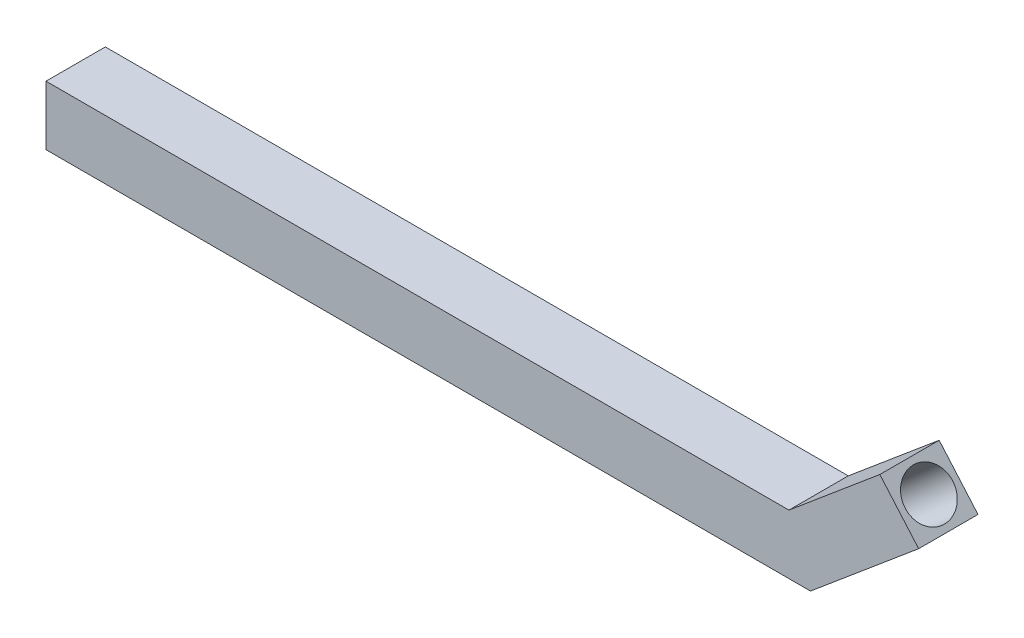
ISO-10303-21;
HEADER;
FILE_DESCRIPTION(('STEP AP214'),'2;1');
FILE_NAME('part.step','',(''),(''),'','','');
FILE_SCHEMA(('AUTOMOTIVE_DESIGN { 1 0 10303 214 1 1 1 1 }'));
ENDSEC;
DATA;
#1=APPLICATION_CONTEXT('core data for automotive mechanical design processes');
#2=APPLICATION_PROTOCOL_DEFINITION('international standard','automotive_design',2000,#1);
#3=PRODUCT_CONTEXT('',#1,'mechanical');
#4=PRODUCT('Part','Part','',(#3));
#5=PRODUCT_RELATED_PRODUCT_CATEGORY('part','',(#4));
#6=PRODUCT_DEFINITION_FORMATION('','',#4);
#7=PRODUCT_DEFINITION_CONTEXT('part definition',#1,'design');
#8=PRODUCT_DEFINITION('design','',#6,#7);
#9=PRODUCT_DEFINITION_SHAPE('','',#8);
#10=(LENGTH_UNIT() NAMED_UNIT(*) SI_UNIT(.MILLI.,.METRE.));
#11=(NAMED_UNIT(*) PLANE_ANGLE_UNIT() SI_UNIT($,.RADIAN.));
#12=(NAMED_UNIT(*) SI_UNIT($,.STERADIAN.) SOLID_ANGLE_UNIT());
#13=UNCERTAINTY_MEASURE_WITH_UNIT(LENGTH_MEASURE(1.E-05),#10,'distance_accuracy_value','');
#14=(GEOMETRIC_REPRESENTATION_CONTEXT(3) GLOBAL_UNCERTAINTY_ASSIGNED_CONTEXT((#13)) GLOBAL_UNIT_ASSIGNED_CONTEXT((#10,
#11,#12)) REPRESENTATION_CONTEXT('',''));
#15=CARTESIAN_POINT('',(0.,0.,0.));
#16=DIRECTION('',(0.,0.,1.));
#17=DIRECTION('',(1.,0.,0.));
#18=AXIS2_PLACEMENT_3D('',#15,#16,#17);
#19=CARTESIAN_POINT('',(-13.3,-2.5,2.5));
#20=DIRECTION('',(0.,1.,0.));
#21=DIRECTION('',(0.,0.,1.));
#22=AXIS2_PLACEMENT_3D('',#19,#20,#21);
#23=PLANE('',#22);
#24=DIRECTION('',(0.,0.,1.));
#25=VECTOR('',#24,1.);
#26=CARTESIAN_POINT('',(-31.3,-2.5,0.));
#27=LINE('',#26,#25);
#28=CARTESIAN_POINT('',(-31.3,-2.5,0.));
#29=VERTEX_POINT('',#28);
#30=CARTESIAN_POINT('',(-31.3,-2.5,2.5));
#31=VERTEX_POINT('',#30);
#32=EDGE_CURVE('E95',#29,#31,#27,.T.);
#33=ORIENTED_EDGE('',*,*,#32,.F.);
#34=DIRECTION('',(1.,0.,0.));
#35=VECTOR('',#34,1.);
#36=CARTESIAN_POINT('',(-13.3,-2.5,0.));
#37=LINE('',#36,#35);
#38=CARTESIAN_POINT('',(0.909480398793596,-2.5,0.));
#39=VERTEX_POINT('',#38);
#40=EDGE_CURVE('E103',#29,#39,#37,.T.);
#41=ORIENTED_EDGE('',*,*,#40,.T.);
#42=DIRECTION('',(0.,0.,-1.));
#43=VECTOR('',#42,1.);
#44=CARTESIAN_POINT('',(0.909480398793596,-2.5,2.5));
#45=LINE('',#44,#43);
#46=CARTESIAN_POINT('',(0.909480398793596,-2.5,2.5));
#47=VERTEX_POINT('',#46);
#48=EDGE_CURVE('E11',#47,#39,#45,.T.);
#49=ORIENTED_EDGE('',*,*,#48,.F.);
#50=DIRECTION('',(1.,0.,0.));
#51=VECTOR('',#50,1.);
#52=CARTESIAN_POINT('',(-13.3,-2.5,2.5));
#53=LINE('',#52,#51);
#54=EDGE_CURVE('E84',#31,#47,#53,.T.);
#55=ORIENTED_EDGE('',*,*,#54,.F.);
#56=EDGE_LOOP('',(#33,#41,#49,#55));
#57=FACE_BOUND('',#56,.T.);
#58=ADVANCED_FACE('F33',(#57),#23,.F.);
#59=CARTESIAN_POINT('',(-13.3,0.,2.5));
#60=DIRECTION('',(0.,-1.,0.));
#61=DIRECTION('',(0.,0.,-1.));
#62=AXIS2_PLACEMENT_3D('',#59,#60,#61);
#63=PLANE('',#62);
#64=DIRECTION('',(0.,0.,-1.));
#65=VECTOR('',#64,1.);
#66=CARTESIAN_POINT('',(-31.3,0.,0.));
#67=LINE('',#66,#65);
#68=CARTESIAN_POINT('',(-31.3,0.,2.5));
#69=VERTEX_POINT('',#68);
#70=CARTESIAN_POINT('',(-31.3,0.,0.));
#71=VERTEX_POINT('',#70);
#72=EDGE_CURVE('E47',#69,#71,#67,.T.);
#73=ORIENTED_EDGE('',*,*,#72,.F.);
#74=DIRECTION('',(-1.,0.,0.));
#75=VECTOR('',#74,1.);
#76=CARTESIAN_POINT('',(-13.3,0.,2.5));
#77=LINE('',#76,#75);
#78=CARTESIAN_POINT('',(0.,0.,2.5));
#79=VERTEX_POINT('',#78);
#80=EDGE_CURVE('E118',#79,#69,#77,.T.);
#81=ORIENTED_EDGE('',*,*,#80,.F.);
#82=DIRECTION('',(0.,0.,-1.));
#83=VECTOR('',#82,1.);
#84=CARTESIAN_POINT('',(0.,0.,2.5));
#85=LINE('',#84,#83);
#86=CARTESIAN_POINT('',(0.,0.,0.));
#87=VERTEX_POINT('',#86);
#88=EDGE_CURVE('E125',#79,#87,#85,.T.);
#89=ORIENTED_EDGE('',*,*,#88,.T.);
#90=DIRECTION('',(-1.,0.,0.));
#91=VECTOR('',#90,1.);
#92=CARTESIAN_POINT('',(-13.3,0.,0.));
#93=LINE('',#92,#91);
#94=EDGE_CURVE('E123',#87,#71,#93,.T.);
#95=ORIENTED_EDGE('',*,*,#94,.T.);
#96=EDGE_LOOP('',(#73,#81,#89,#95));
#97=FACE_BOUND('',#96,.T.);
#98=ADVANCED_FACE('F138',(#97),#63,.F.);
#99=CARTESIAN_POINT('',(0.,0.,2.5));
#100=DIRECTION('',(0.,0.,1.));
#101=DIRECTION('',(1.,0.,0.));
#102=AXIS2_PLACEMENT_3D('',#99,#100,#101);
#103=PLANE('',#102);
#104=ORIENTED_EDGE('',*,*,#80,.T.);
#105=DIRECTION('',(0.,1.,0.));
#106=VECTOR('',#105,1.);
#107=CARTESIAN_POINT('',(-31.3,0.,2.5));
#108=LINE('',#107,#106);
#109=EDGE_CURVE('E104',#31,#69,#108,.T.);
#110=ORIENTED_EDGE('',*,*,#109,.F.);
#111=ORIENTED_EDGE('',*,*,#54,.T.);
#112=DIRECTION('',(0.766044443118977,0.64278760968654,0.));
#113=VECTOR('',#112,1.);
#114=CARTESIAN_POINT('',(0.909480398793596,-2.5,2.5));
#115=LINE('',#114,#113);
#116=CARTESIAN_POINT('',(5.46598283431779,1.32335951310674,2.5));
#117=VERTEX_POINT('',#116);
#118=EDGE_CURVE('E141',#47,#117,#115,.T.);
#119=ORIENTED_EDGE('',*,*,#118,.T.);
#120=DIRECTION('',(-0.65430424748916,0.756231414130386,0.));
#121=VECTOR('',#120,1.);
#122=CARTESIAN_POINT('',(5.46598283431779,1.32335951310674,2.5));
#123=LINE('',#122,#121);
#124=CARTESIAN_POINT('',(3.83022221559489,3.2139380484327,2.5));
#125=VERTEX_POINT('',#124);
#126=EDGE_CURVE('E134',#117,#125,#123,.T.);
#127=ORIENTED_EDGE('',*,*,#126,.T.);
#128=DIRECTION('',(-0.766044443118977,-0.64278760968654,0.));
#129=VECTOR('',#128,1.);
#130=CARTESIAN_POINT('',(0.,0.,2.5));
#131=LINE('',#130,#129);
#132=EDGE_CURVE('E56',#125,#79,#131,.T.);
#133=ORIENTED_EDGE('',*,*,#132,.T.);
#134=EDGE_LOOP('',(#104,#110,#111,#119,#127,#133));
#135=FACE_BOUND('',#134,.T.);
#136=ADVANCED_FACE('F177',(#135),#103,.T.);
#137=CARTESIAN_POINT('',(0.,0.,0.));
#138=DIRECTION('',(0.,0.,1.));
#139=DIRECTION('',(1.,0.,0.));
#140=AXIS2_PLACEMENT_3D('',#137,#138,#139);
#141=PLANE('',#140);
#142=DIRECTION('',(0.,-1.,0.));
#143=VECTOR('',#142,1.);
#144=CARTESIAN_POINT('',(-31.3,0.,0.));
#145=LINE('',#144,#143);
#146=EDGE_CURVE('E92',#71,#29,#145,.T.);
#147=ORIENTED_EDGE('',*,*,#146,.F.);
#148=ORIENTED_EDGE('',*,*,#94,.F.);
#149=DIRECTION('',(-0.766044443118977,-0.64278760968654,0.));
#150=VECTOR('',#149,1.);
#151=CARTESIAN_POINT('',(0.,0.,0.));
#152=LINE('',#151,#150);
#153=CARTESIAN_POINT('',(3.83022221559489,3.2139380484327,0.));
#154=VERTEX_POINT('',#153);
#155=EDGE_CURVE('E77',#154,#87,#152,.T.);
#156=ORIENTED_EDGE('',*,*,#155,.F.);
#157=DIRECTION('',(-0.65430424748916,0.756231414130386,0.));
#158=VECTOR('',#157,1.);
#159=CARTESIAN_POINT('',(5.46598283431779,1.32335951310674,0.));
#160=LINE('',#159,#158);
#161=CARTESIAN_POINT('',(5.46598283431779,1.32335951310674,0.));
#162=VERTEX_POINT('',#161);
#163=EDGE_CURVE('E112',#162,#154,#160,.T.);
#164=ORIENTED_EDGE('',*,*,#163,.F.);
#165=DIRECTION('',(0.766044443118977,0.64278760968654,0.));
#166=VECTOR('',#165,1.);
#167=CARTESIAN_POINT('',(0.909480398793596,-2.5,0.));
#168=LINE('',#167,#166);
#169=EDGE_CURVE('E109',#39,#162,#168,.T.);
#170=ORIENTED_EDGE('',*,*,#169,.F.);
#171=ORIENTED_EDGE('',*,*,#40,.F.);
#172=EDGE_LOOP('',(#147,#148,#156,#164,#170,#171));
#173=FACE_BOUND('',#172,.T.);
#174=ADVANCED_FACE('F107',(#173),#141,.F.);
#175=CARTESIAN_POINT('',(0.909480398793596,-2.5,2.5));
#176=DIRECTION('',(-0.64278760968654,0.766044443118977,0.));
#177=DIRECTION('',(-0.766044443118977,-0.64278760968654,0.));
#178=AXIS2_PLACEMENT_3D('',#175,#176,#177);
#179=PLANE('',#178);
#180=ORIENTED_EDGE('',*,*,#169,.T.);
#181=DIRECTION('',(0.,0.,-1.));
#182=VECTOR('',#181,1.);
#183=CARTESIAN_POINT('',(5.46598283431779,1.32335951310674,2.5));
#184=LINE('',#183,#182);
#185=EDGE_CURVE('E40',#117,#162,#184,.T.);
#186=ORIENTED_EDGE('',*,*,#185,.F.);
#187=ORIENTED_EDGE('',*,*,#118,.F.);
#188=ORIENTED_EDGE('',*,*,#48,.T.);
#189=EDGE_LOOP('',(#180,#186,#187,#188));
#190=FACE_BOUND('',#189,.T.);
#191=ADVANCED_FACE('F188',(#190),#179,.F.);
#192=CARTESIAN_POINT('',(5.46598283431779,1.32335951310674,2.5));
#193=DIRECTION('',(-0.756231414130386,-0.65430424748916,0.));
#194=DIRECTION('',(0.65430424748916,-0.756231414130386,0.));
#195=AXIS2_PLACEMENT_3D('',#192,#193,#194);
#196=PLANE('',#195);
#197=CARTESIAN_POINT('',(4.64810252495634,2.26864878076972,1.25));
#198=DIRECTION('',(0.756231414130386,0.65430424748916,0.));
#199=DIRECTION('',(-0.65430424748916,0.756231414130386,0.));
#200=AXIS2_PLACEMENT_3D('',#197,#198,#199);
#201=CIRCLE('',#200,1.);
#202=CARTESIAN_POINT('',(3.99379827746718,3.02488019490011,1.25));
#203=VERTEX_POINT('',#202);
#204=EDGE_CURVE('E115',#203,#203,#201,.T.);
#205=ORIENTED_EDGE('',*,*,#204,.F.);
#206=EDGE_LOOP('',(#205));
#207=FACE_BOUND('',#206,.T.);
#208=ORIENTED_EDGE('',*,*,#163,.T.);
#209=DIRECTION('',(0.,0.,-1.));
#210=VECTOR('',#209,1.);
#211=CARTESIAN_POINT('',(3.83022221559489,3.2139380484327,2.5));
#212=LINE('',#211,#210);
#213=EDGE_CURVE('E127',#125,#154,#212,.T.);
#214=ORIENTED_EDGE('',*,*,#213,.F.);
#215=ORIENTED_EDGE('',*,*,#126,.F.);
#216=ORIENTED_EDGE('',*,*,#185,.T.);
#217=EDGE_LOOP('',(#208,#214,#215,#216));
#218=FACE_BOUND('',#217,.T.);
#219=ADVANCED_FACE('F132',(#207,#218),#196,.F.);
#220=CARTESIAN_POINT('',(0.,0.,2.5));
#221=DIRECTION('',(0.64278760968654,-0.766044443118977,0.));
#222=DIRECTION('',(0.766044443118977,0.64278760968654,0.));
#223=AXIS2_PLACEMENT_3D('',#220,#221,#222);
#224=PLANE('',#223);
#225=ORIENTED_EDGE('',*,*,#155,.T.);
#226=ORIENTED_EDGE('',*,*,#88,.F.);
#227=ORIENTED_EDGE('',*,*,#132,.F.);
#228=ORIENTED_EDGE('',*,*,#213,.T.);
#229=EDGE_LOOP('',(#225,#226,#227,#228));
#230=FACE_BOUND('',#229,.T.);
#231=ADVANCED_FACE('F140',(#230),#224,.F.);
#232=CARTESIAN_POINT('',(0.866945454304408,-1.00287245667608,1.25));
#233=DIRECTION('',(0.756231414130386,0.65430424748916,0.));
#234=DIRECTION('',(-0.65430424748916,0.756231414130386,0.));
#235=AXIS2_PLACEMENT_3D('',#232,#233,#234);
#236=CYLINDRICAL_SURFACE('',#235,1.);
#237=CARTESIAN_POINT('',(0.866945454304408,-1.00287245667608,1.25));
#238=DIRECTION('',(0.756231414130386,0.65430424748916,0.));
#239=DIRECTION('',(-0.65430424748916,0.756231414130386,0.));
#240=AXIS2_PLACEMENT_3D('',#237,#238,#239);
#241=CIRCLE('',#240,1.);
#242=CARTESIAN_POINT('',(0.212641206815247,-0.246641042545697,1.25));
#243=VERTEX_POINT('',#242);
#244=EDGE_CURVE('E110',#243,#243,#241,.T.);
#245=ORIENTED_EDGE('',*,*,#244,.F.);
#246=EDGE_LOOP('',(#245));
#247=FACE_BOUND('',#246,.T.);
#248=ORIENTED_EDGE('',*,*,#204,.T.);
#249=EDGE_LOOP('',(#248));
#250=FACE_BOUND('',#249,.T.);
#251=ADVANCED_FACE('F170',(#247,#250),#236,.F.);
#252=CARTESIAN_POINT('',(0.866945454304408,-1.00287245667608,1.25));
#253=DIRECTION('',(0.756231414130386,0.65430424748916,0.));
#254=DIRECTION('',(-0.65430424748916,0.756231414130386,0.));
#255=AXIS2_PLACEMENT_3D('',#252,#253,#254);
#256=PLANE('',#255);
#257=ORIENTED_EDGE('',*,*,#244,.T.);
#258=EDGE_LOOP('',(#257));
#259=FACE_BOUND('',#258,.T.);
#260=ADVANCED_FACE('F165',(#259),#256,.T.);
#261=CARTESIAN_POINT('',(-31.3,0.,0.));
#262=DIRECTION('',(-1.,0.,0.));
#263=DIRECTION('',(0.,0.,1.));
#264=AXIS2_PLACEMENT_3D('',#261,#262,#263);
#265=PLANE('',#264);
#266=CARTESIAN_POINT('',(-31.3,-1.25,1.25));
#267=DIRECTION('',(-1.,0.,0.));
#268=DIRECTION('',(0.,0.,1.));
#269=AXIS2_PLACEMENT_3D('',#266,#267,#268);
#270=CIRCLE('',#269,1.);
#271=CARTESIAN_POINT('',(-31.3,-1.25,2.25));
#272=VERTEX_POINT('',#271);
#273=EDGE_CURVE('E150',#272,#272,#270,.T.);
#274=ORIENTED_EDGE('',*,*,#273,.F.);
#275=EDGE_LOOP('',(#274));
#276=FACE_BOUND('',#275,.T.);
#277=ORIENTED_EDGE('',*,*,#146,.T.);
#278=ORIENTED_EDGE('',*,*,#32,.T.);
#279=ORIENTED_EDGE('',*,*,#109,.T.);
#280=ORIENTED_EDGE('',*,*,#72,.T.);
#281=EDGE_LOOP('',(#277,#278,#279,#280));
#282=FACE_BOUND('',#281,.T.);
#283=ADVANCED_FACE('F94',(#276,#282),#265,.T.);
#284=CARTESIAN_POINT('',(-26.3,-1.25,1.25));
#285=DIRECTION('',(-1.,0.,0.));
#286=DIRECTION('',(0.,0.,1.));
#287=AXIS2_PLACEMENT_3D('',#284,#285,#286);
#288=CYLINDRICAL_SURFACE('',#287,1.);
#289=CARTESIAN_POINT('',(-26.3,-1.25,1.25));
#290=DIRECTION('',(-1.,0.,0.));
#291=DIRECTION('',(0.,0.,1.));
#292=AXIS2_PLACEMENT_3D('',#289,#290,#291);
#293=CIRCLE('',#292,1.);
#294=CARTESIAN_POINT('',(-26.3,-1.25,2.25));
#295=VERTEX_POINT('',#294);
#296=EDGE_CURVE('E100',#295,#295,#293,.T.);
#297=ORIENTED_EDGE('',*,*,#296,.F.);
#298=EDGE_LOOP('',(#297));
#299=FACE_BOUND('',#298,.T.);
#300=ORIENTED_EDGE('',*,*,#273,.T.);
#301=EDGE_LOOP('',(#300));
#302=FACE_BOUND('',#301,.T.);
#303=ADVANCED_FACE('F158',(#299,#302),#288,.F.);
#304=CARTESIAN_POINT('',(-26.3,0.,0.));
#305=DIRECTION('',(-1.,0.,0.));
#306=DIRECTION('',(0.,0.,1.));
#307=AXIS2_PLACEMENT_3D('',#304,#305,#306);
#308=PLANE('',#307);
#309=ORIENTED_EDGE('',*,*,#296,.T.);
#310=EDGE_LOOP('',(#309));
#311=FACE_BOUND('',#310,.T.);
#312=ADVANCED_FACE('F156',(#311),#308,.T.);
#313=CLOSED_SHELL('',(#58,#98,#136,#174,#191,#219,#231,#251,#260,#283,#303,#312));
#314=MANIFOLD_SOLID_BREP('B2',#313);
#315=ADVANCED_BREP_SHAPE_REPRESENTATION('',(#18,#314),#14);
#316=SHAPE_DEFINITION_REPRESENTATION(#9,#315);
ENDSEC;
END-ISO-10303-21;
